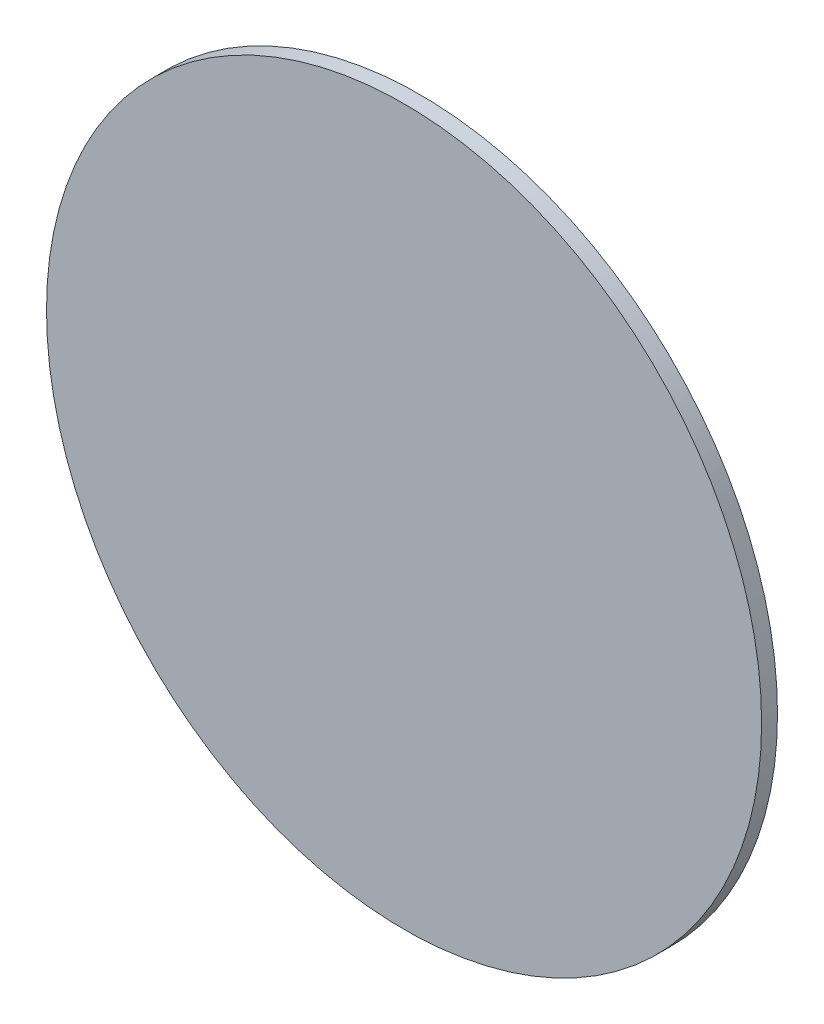
ISO-10303-21;
HEADER;
FILE_DESCRIPTION(('STEP AP214'),'2;1');
FILE_NAME('part.step','',(''),(''),'','','');
FILE_SCHEMA(('AUTOMOTIVE_DESIGN { 1 0 10303 214 1 1 1 1 }'));
ENDSEC;
DATA;
#1=APPLICATION_CONTEXT('core data for automotive mechanical design processes');
#2=APPLICATION_PROTOCOL_DEFINITION('international standard','automotive_design',2000,#1);
#3=PRODUCT_CONTEXT('',#1,'mechanical');
#4=PRODUCT('Part','Part','',(#3));
#5=PRODUCT_RELATED_PRODUCT_CATEGORY('part','',(#4));
#6=PRODUCT_DEFINITION_FORMATION('','',#4);
#7=PRODUCT_DEFINITION_CONTEXT('part definition',#1,'design');
#8=PRODUCT_DEFINITION('design','',#6,#7);
#9=PRODUCT_DEFINITION_SHAPE('','',#8);
#10=(LENGTH_UNIT() NAMED_UNIT(*) SI_UNIT(.MILLI.,.METRE.));
#11=(NAMED_UNIT(*) PLANE_ANGLE_UNIT() SI_UNIT($,.RADIAN.));
#12=(NAMED_UNIT(*) SI_UNIT($,.STERADIAN.) SOLID_ANGLE_UNIT());
#13=UNCERTAINTY_MEASURE_WITH_UNIT(LENGTH_MEASURE(1.E-05),#10,'distance_accuracy_value','');
#14=(GEOMETRIC_REPRESENTATION_CONTEXT(3) GLOBAL_UNCERTAINTY_ASSIGNED_CONTEXT((#13)) GLOBAL_UNIT_ASSIGNED_CONTEXT((#10,
#11,#12)) REPRESENTATION_CONTEXT('',''));
#15=CARTESIAN_POINT('',(0.,0.,0.));
#16=DIRECTION('',(0.,0.,1.));
#17=DIRECTION('',(1.,0.,0.));
#18=AXIS2_PLACEMENT_3D('',#15,#16,#17);
#19=CARTESIAN_POINT('',(0.,0.,2.));
#20=DIRECTION('',(0.,0.,-1.));
#21=DIRECTION('',(-1.,0.,0.));
#22=AXIS2_PLACEMENT_3D('',#19,#20,#21);
#23=CYLINDRICAL_SURFACE('',#22,45.);
#24=CARTESIAN_POINT('',(0.,0.,2.));
#25=DIRECTION('',(0.,0.,1.));
#26=DIRECTION('',(1.,0.,0.));
#27=AXIS2_PLACEMENT_3D('',#24,#25,#26);
#28=CIRCLE('',#27,45.);
#29=CARTESIAN_POINT('',(45.,0.,2.));
#30=VERTEX_POINT('',#29);
#31=EDGE_CURVE('E10',#30,#30,#28,.T.);
#32=ORIENTED_EDGE('',*,*,#31,.F.);
#33=EDGE_LOOP('',(#32));
#34=FACE_BOUND('',#33,.T.);
#35=CARTESIAN_POINT('',(0.,0.,0.));
#36=DIRECTION('',(0.,0.,1.));
#37=DIRECTION('',(1.,0.,0.));
#38=AXIS2_PLACEMENT_3D('',#35,#36,#37);
#39=CIRCLE('',#38,45.);
#40=CARTESIAN_POINT('',(45.,0.,0.));
#41=VERTEX_POINT('',#40);
#42=EDGE_CURVE('E35',#41,#41,#39,.T.);
#43=ORIENTED_EDGE('',*,*,#42,.T.);
#44=EDGE_LOOP('',(#43));
#45=FACE_BOUND('',#44,.T.);
#46=ADVANCED_FACE('F32',(#34,#45),#23,.T.);
#47=CARTESIAN_POINT('',(0.,0.,2.));
#48=DIRECTION('',(0.,0.,1.));
#49=DIRECTION('',(1.,0.,0.));
#50=AXIS2_PLACEMENT_3D('',#47,#48,#49);
#51=PLANE('',#50);
#52=ORIENTED_EDGE('',*,*,#31,.T.);
#53=EDGE_LOOP('',(#52));
#54=FACE_BOUND('',#53,.T.);
#55=ADVANCED_FACE('F47',(#54),#51,.T.);
#56=CARTESIAN_POINT('',(0.,0.,0.));
#57=DIRECTION('',(0.,0.,1.));
#58=DIRECTION('',(1.,0.,0.));
#59=AXIS2_PLACEMENT_3D('',#56,#57,#58);
#60=PLANE('',#59);
#61=ORIENTED_EDGE('',*,*,#42,.F.);
#62=EDGE_LOOP('',(#61));
#63=FACE_BOUND('',#62,.T.);
#64=ADVANCED_FACE('F45',(#63),#60,.F.);
#65=CLOSED_SHELL('',(#46,#55,#64));
#66=MANIFOLD_SOLID_BREP('B2',#65);
#67=ADVANCED_BREP_SHAPE_REPRESENTATION('',(#18,#66),#14);
#68=SHAPE_DEFINITION_REPRESENTATION(#9,#67);
ENDSEC;
END-ISO-10303-21;
